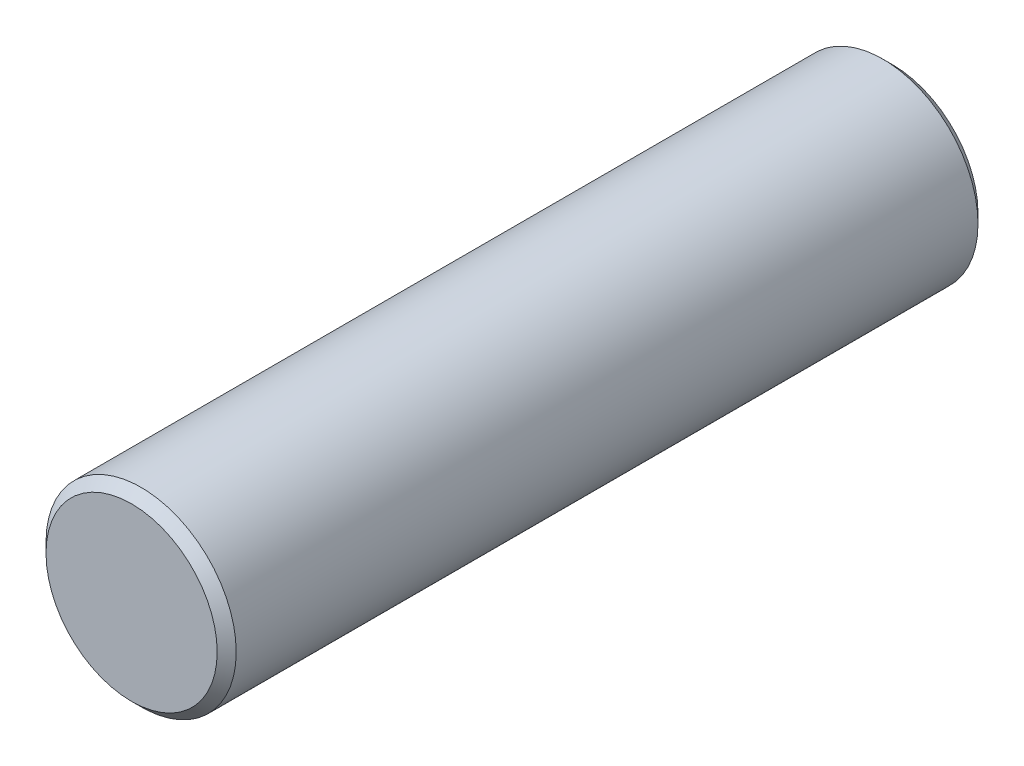
ISO-10303-21;
HEADER;
FILE_DESCRIPTION(('STEP AP214'),'2;1');
FILE_NAME('part.step','',(''),(''),'','','');
FILE_SCHEMA(('AUTOMOTIVE_DESIGN { 1 0 10303 214 1 1 1 1 }'));
ENDSEC;
DATA;
#1=APPLICATION_CONTEXT('core data for automotive mechanical design processes');
#2=APPLICATION_PROTOCOL_DEFINITION('international standard','automotive_design',2000,#1);
#3=PRODUCT_CONTEXT('',#1,'mechanical');
#4=PRODUCT('Part','Part','',(#3));
#5=PRODUCT_RELATED_PRODUCT_CATEGORY('part','',(#4));
#6=PRODUCT_DEFINITION_FORMATION('','',#4);
#7=PRODUCT_DEFINITION_CONTEXT('part definition',#1,'design');
#8=PRODUCT_DEFINITION('design','',#6,#7);
#9=PRODUCT_DEFINITION_SHAPE('','',#8);
#10=(LENGTH_UNIT() NAMED_UNIT(*) SI_UNIT(.MILLI.,.METRE.));
#11=(NAMED_UNIT(*) PLANE_ANGLE_UNIT() SI_UNIT($,.RADIAN.));
#12=(NAMED_UNIT(*) SI_UNIT($,.STERADIAN.) SOLID_ANGLE_UNIT());
#13=UNCERTAINTY_MEASURE_WITH_UNIT(LENGTH_MEASURE(1.E-05),#10,'distance_accuracy_value','');
#14=(GEOMETRIC_REPRESENTATION_CONTEXT(3) GLOBAL_UNCERTAINTY_ASSIGNED_CONTEXT((#13)) GLOBAL_UNIT_ASSIGNED_CONTEXT((#10,
#11,#12)) REPRESENTATION_CONTEXT('',''));
#15=CARTESIAN_POINT('',(0.,0.,0.));
#16=DIRECTION('',(0.,0.,1.));
#17=DIRECTION('',(1.,0.,0.));
#18=AXIS2_PLACEMENT_3D('',#15,#16,#17);
#19=CARTESIAN_POINT('',(0.,0.,4.));
#20=DIRECTION('',(0.,0.,-1.));
#21=DIRECTION('',(-1.,0.,0.));
#22=AXIS2_PLACEMENT_3D('',#19,#20,#21);
#23=CYLINDRICAL_SURFACE('',#22,1.);
#24=CARTESIAN_POINT('',(0.,0.,-3.9));
#25=DIRECTION('',(0.,0.,1.));
#26=DIRECTION('',(1.,0.,0.));
#27=AXIS2_PLACEMENT_3D('',#24,#25,#26);
#28=CIRCLE('',#27,1.);
#29=CARTESIAN_POINT('',(1.,0.,-3.9));
#30=VERTEX_POINT('',#29);
#31=EDGE_CURVE('E45',#30,#30,#28,.T.);
#32=ORIENTED_EDGE('',*,*,#31,.T.);
#33=EDGE_LOOP('',(#32));
#34=FACE_BOUND('',#33,.T.);
#35=CARTESIAN_POINT('',(0.,0.,3.9));
#36=DIRECTION('',(0.,0.,1.));
#37=DIRECTION('',(1.,0.,0.));
#38=AXIS2_PLACEMENT_3D('',#35,#36,#37);
#39=CIRCLE('',#38,1.);
#40=CARTESIAN_POINT('',(1.,0.,3.9));
#41=VERTEX_POINT('',#40);
#42=EDGE_CURVE('E49',#41,#41,#39,.F.);
#43=ORIENTED_EDGE('',*,*,#42,.T.);
#44=EDGE_LOOP('',(#43));
#45=FACE_BOUND('',#44,.T.);
#46=ADVANCED_FACE('F33',(#34,#45),#23,.T.);
#47=CARTESIAN_POINT('',(0.,0.,4.));
#48=DIRECTION('',(0.,0.,1.));
#49=DIRECTION('',(1.,0.,0.));
#50=AXIS2_PLACEMENT_3D('',#47,#48,#49);
#51=PLANE('',#50);
#52=CARTESIAN_POINT('',(0.,0.,4.));
#53=DIRECTION('',(0.,0.,1.));
#54=DIRECTION('',(1.,0.,0.));
#55=AXIS2_PLACEMENT_3D('',#52,#53,#54);
#56=CIRCLE('',#55,0.9);
#57=CARTESIAN_POINT('',(0.9,0.,4.));
#58=VERTEX_POINT('',#57);
#59=EDGE_CURVE('E10',#58,#58,#56,.T.);
#60=ORIENTED_EDGE('',*,*,#59,.T.);
#61=EDGE_LOOP('',(#60));
#62=FACE_BOUND('',#61,.T.);
#63=ADVANCED_FACE('F65',(#62),#51,.T.);
#64=CARTESIAN_POINT('',(0.,0.,-4.));
#65=DIRECTION('',(0.,0.,1.));
#66=DIRECTION('',(1.,0.,0.));
#67=AXIS2_PLACEMENT_3D('',#64,#65,#66);
#68=PLANE('',#67);
#69=CARTESIAN_POINT('',(0.,0.,-4.));
#70=DIRECTION('',(0.,0.,1.));
#71=DIRECTION('',(1.,0.,0.));
#72=AXIS2_PLACEMENT_3D('',#69,#70,#71);
#73=CIRCLE('',#72,0.899999999999999);
#74=CARTESIAN_POINT('',(0.899999999999999,0.,-4.));
#75=VERTEX_POINT('',#74);
#76=EDGE_CURVE('E41',#75,#75,#73,.F.);
#77=ORIENTED_EDGE('',*,*,#76,.T.);
#78=EDGE_LOOP('',(#77));
#79=FACE_BOUND('',#78,.T.);
#80=ADVANCED_FACE('F62',(#79),#68,.F.);
#81=CARTESIAN_POINT('',(0.,0.,-3.9));
#82=DIRECTION('',(0.,0.,1.));
#83=DIRECTION('',(1.,0.,0.));
#84=AXIS2_PLACEMENT_3D('',#81,#82,#83);
#85=CONICAL_SURFACE('',#84,1.,0.78539816339744);
#86=ORIENTED_EDGE('',*,*,#76,.F.);
#87=EDGE_LOOP('',(#86));
#88=FACE_BOUND('',#87,.T.);
#89=ORIENTED_EDGE('',*,*,#31,.F.);
#90=EDGE_LOOP('',(#89));
#91=FACE_BOUND('',#90,.T.);
#92=ADVANCED_FACE('F58',(#88,#91),#85,.T.);
#93=CARTESIAN_POINT('',(0.,0.,4.));
#94=DIRECTION('',(0.,0.,-1.));
#95=DIRECTION('',(-1.,0.,0.));
#96=AXIS2_PLACEMENT_3D('',#93,#94,#95);
#97=CONICAL_SURFACE('',#96,0.9,0.785398163397448);
#98=ORIENTED_EDGE('',*,*,#42,.F.);
#99=EDGE_LOOP('',(#98));
#100=FACE_BOUND('',#99,.T.);
#101=ORIENTED_EDGE('',*,*,#59,.F.);
#102=EDGE_LOOP('',(#101));
#103=FACE_BOUND('',#102,.T.);
#104=ADVANCED_FACE('F36',(#100,#103),#97,.T.);
#105=CLOSED_SHELL('',(#46,#63,#80,#92,#104));
#106=MANIFOLD_SOLID_BREP('B2',#105);
#107=ADVANCED_BREP_SHAPE_REPRESENTATION('',(#18,#106),#14);
#108=SHAPE_DEFINITION_REPRESENTATION(#9,#107);
ENDSEC;
END-ISO-10303-21;
